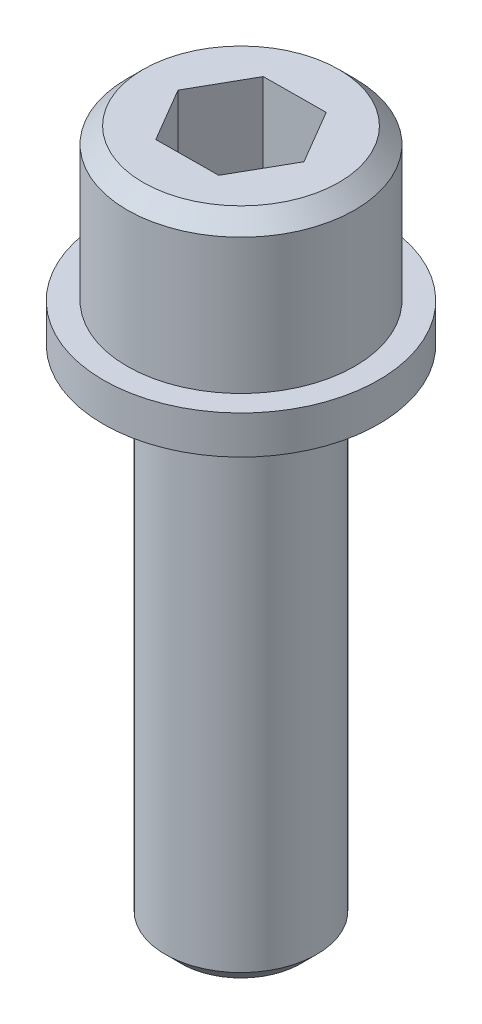
ISO-10303-21;
HEADER;
FILE_DESCRIPTION(('STEP AP214'),'2;1');
FILE_NAME('part.step','',(''),(''),'','','');
FILE_SCHEMA(('AUTOMOTIVE_DESIGN { 1 0 10303 214 1 1 1 1 }'));
ENDSEC;
DATA;
#1=APPLICATION_CONTEXT('core data for automotive mechanical design processes');
#2=APPLICATION_PROTOCOL_DEFINITION('international standard','automotive_design',2000,#1);
#3=PRODUCT_CONTEXT('',#1,'mechanical');
#4=PRODUCT('Part','Part','',(#3));
#5=PRODUCT_RELATED_PRODUCT_CATEGORY('part','',(#4));
#6=PRODUCT_DEFINITION_FORMATION('','',#4);
#7=PRODUCT_DEFINITION_CONTEXT('part definition',#1,'design');
#8=PRODUCT_DEFINITION('design','',#6,#7);
#9=PRODUCT_DEFINITION_SHAPE('','',#8);
#10=(LENGTH_UNIT() NAMED_UNIT(*) SI_UNIT(.MILLI.,.METRE.));
#11=(NAMED_UNIT(*) PLANE_ANGLE_UNIT() SI_UNIT($,.RADIAN.));
#12=(NAMED_UNIT(*) SI_UNIT($,.STERADIAN.) SOLID_ANGLE_UNIT());
#13=UNCERTAINTY_MEASURE_WITH_UNIT(LENGTH_MEASURE(1.E-05),#10,'distance_accuracy_value','');
#14=(GEOMETRIC_REPRESENTATION_CONTEXT(3) GLOBAL_UNCERTAINTY_ASSIGNED_CONTEXT((#13)) GLOBAL_UNIT_ASSIGNED_CONTEXT((#10,
#11,#12)) REPRESENTATION_CONTEXT('',''));
#15=CARTESIAN_POINT('',(0.,0.,0.));
#16=DIRECTION('',(0.,0.,1.));
#17=DIRECTION('',(1.,0.,0.));
#18=AXIS2_PLACEMENT_3D('',#15,#16,#17);
#19=CARTESIAN_POINT('',(0.,2.4,0.));
#20=DIRECTION('',(0.,-1.,0.));
#21=DIRECTION('',(0.,0.,-1.));
#22=AXIS2_PLACEMENT_3D('',#19,#20,#21);
#23=CYLINDRICAL_SURFACE('',#22,8.64999999999999);
#24=CARTESIAN_POINT('',(0.,2.4,0.));
#25=DIRECTION('',(0.,1.,0.));
#26=DIRECTION('',(0.,0.,1.));
#27=AXIS2_PLACEMENT_3D('',#24,#25,#26);
#28=CIRCLE('',#27,8.64999999999999);
#29=CARTESIAN_POINT('',(0.,2.4,8.64999999999999));
#30=VERTEX_POINT('',#29);
#31=EDGE_CURVE('E182',#30,#30,#28,.T.);
#32=ORIENTED_EDGE('',*,*,#31,.F.);
#33=EDGE_LOOP('',(#32));
#34=FACE_BOUND('',#33,.T.);
#35=CARTESIAN_POINT('',(0.,0.,0.));
#36=DIRECTION('',(0.,1.,0.));
#37=DIRECTION('',(0.,0.,1.));
#38=AXIS2_PLACEMENT_3D('',#35,#36,#37);
#39=CIRCLE('',#38,8.64999999999999);
#40=CARTESIAN_POINT('',(0.,0.,8.64999999999999));
#41=VERTEX_POINT('',#40);
#42=EDGE_CURVE('E167',#41,#41,#39,.T.);
#43=ORIENTED_EDGE('',*,*,#42,.T.);
#44=EDGE_LOOP('',(#43));
#45=FACE_BOUND('',#44,.T.);
#46=ADVANCED_FACE('F51',(#34,#45),#23,.T.);
#47=CARTESIAN_POINT('',(0.,2.4,0.));
#48=DIRECTION('',(0.,1.,0.));
#49=DIRECTION('',(0.,0.,1.));
#50=AXIS2_PLACEMENT_3D('',#47,#48,#49);
#51=PLANE('',#50);
#52=CARTESIAN_POINT('',(0.,2.4,0.));
#53=DIRECTION('',(0.,1.,0.));
#54=DIRECTION('',(0.,0.,1.));
#55=AXIS2_PLACEMENT_3D('',#52,#53,#54);
#56=CIRCLE('',#55,7.15);
#57=CARTESIAN_POINT('',(0.,2.4,7.15));
#58=VERTEX_POINT('',#57);
#59=EDGE_CURVE('E177',#58,#58,#56,.T.);
#60=ORIENTED_EDGE('',*,*,#59,.F.);
#61=EDGE_LOOP('',(#60));
#62=FACE_BOUND('',#61,.T.);
#63=ORIENTED_EDGE('',*,*,#31,.T.);
#64=EDGE_LOOP('',(#63));
#65=FACE_BOUND('',#64,.T.);
#66=ADVANCED_FACE('F231',(#62,#65),#51,.T.);
#67=CARTESIAN_POINT('',(0.,0.,0.));
#68=DIRECTION('',(0.,1.,0.));
#69=DIRECTION('',(0.,0.,1.));
#70=AXIS2_PLACEMENT_3D('',#67,#68,#69);
#71=PLANE('',#70);
#72=CARTESIAN_POINT('',(0.,0.,0.));
#73=DIRECTION('',(0.,-1.,0.));
#74=DIRECTION('',(0.,0.,-1.));
#75=AXIS2_PLACEMENT_3D('',#72,#73,#74);
#76=CIRCLE('',#75,4.75);
#77=CARTESIAN_POINT('',(0.,0.,-4.75));
#78=VERTEX_POINT('',#77);
#79=EDGE_CURVE('E195',#78,#78,#76,.T.);
#80=ORIENTED_EDGE('',*,*,#79,.F.);
#81=EDGE_LOOP('',(#80));
#82=FACE_BOUND('',#81,.T.);
#83=ORIENTED_EDGE('',*,*,#42,.F.);
#84=EDGE_LOOP('',(#83));
#85=FACE_BOUND('',#84,.T.);
#86=ADVANCED_FACE('F237',(#82,#85),#71,.F.);
#87=CARTESIAN_POINT('',(0.,11.9,0.));
#88=DIRECTION('',(0.,-1.,0.));
#89=DIRECTION('',(0.,0.,-1.));
#90=AXIS2_PLACEMENT_3D('',#87,#88,#89);
#91=CYLINDRICAL_SURFACE('',#90,7.15);
#92=CARTESIAN_POINT('',(0.,10.9,0.));
#93=DIRECTION('',(0.,1.,0.));
#94=DIRECTION('',(0.,0.,1.));
#95=AXIS2_PLACEMENT_3D('',#92,#93,#94);
#96=CIRCLE('',#95,7.15);
#97=CARTESIAN_POINT('',(0.,10.9,7.15));
#98=VERTEX_POINT('',#97);
#99=EDGE_CURVE('E192',#98,#98,#96,.F.);
#100=ORIENTED_EDGE('',*,*,#99,.T.);
#101=EDGE_LOOP('',(#100));
#102=FACE_BOUND('',#101,.T.);
#103=ORIENTED_EDGE('',*,*,#59,.T.);
#104=EDGE_LOOP('',(#103));
#105=FACE_BOUND('',#104,.T.);
#106=ADVANCED_FACE('F252',(#102,#105),#91,.T.);
#107=CARTESIAN_POINT('',(0.,11.9,0.));
#108=DIRECTION('',(0.,1.,0.));
#109=DIRECTION('',(0.,0.,1.));
#110=AXIS2_PLACEMENT_3D('',#107,#108,#109);
#111=PLANE('',#110);
#112=DIRECTION('',(-0.999973008537401,0.,0.00734725776461483));
#113=VECTOR('',#112,1.);
#114=CARTESIAN_POINT('',(1.93795725484917,11.9,-3.41433082927106));
#115=LINE('',#114,#113);
#116=CARTESIAN_POINT('',(1.93795725484917,11.9,-3.41433082927106));
#117=VERTEX_POINT('',#116);
#118=CARTESIAN_POINT('',(-1.98791860764855,11.9,-3.38548562878326));
#119=VERTEX_POINT('',#118);
#120=EDGE_CURVE('E68',#117,#119,#115,.T.);
#121=ORIENTED_EDGE('',*,*,#120,.F.);
#122=DIRECTION('',(-0.506349416141009,0.,-0.862328399609835));
#123=VECTOR('',#122,1.);
#124=CARTESIAN_POINT('',(3.92587586249771,11.9,-0.0288452004878007));
#125=LINE('',#124,#123);
#126=CARTESIAN_POINT('',(3.92587586249771,11.9,-0.0288452004878007));
#127=VERTEX_POINT('',#126);
#128=EDGE_CURVE('E161',#127,#117,#125,.T.);
#129=ORIENTED_EDGE('',*,*,#128,.F.);
#130=DIRECTION('',(0.493623592396392,0.,-0.86967565737445));
#131=VECTOR('',#130,1.);
#132=CARTESIAN_POINT('',(1.98791860764855,11.9,3.38548562878326));
#133=LINE('',#132,#131);
#134=CARTESIAN_POINT('',(1.98791860764855,11.9,3.38548562878326));
#135=VERTEX_POINT('',#134);
#136=EDGE_CURVE('E158',#135,#127,#133,.T.);
#137=ORIENTED_EDGE('',*,*,#136,.F.);
#138=DIRECTION('',(0.999973008537401,0.,-0.00734725776461495));
#139=VECTOR('',#138,1.);
#140=CARTESIAN_POINT('',(-1.93795725484917,11.9,3.41433082927106));
#141=LINE('',#140,#139);
#142=CARTESIAN_POINT('',(-1.93795725484917,11.9,3.41433082927106));
#143=VERTEX_POINT('',#142);
#144=EDGE_CURVE('E116',#143,#135,#141,.T.);
#145=ORIENTED_EDGE('',*,*,#144,.F.);
#146=DIRECTION('',(0.506349416141009,0.,0.862328399609835));
#147=VECTOR('',#146,1.);
#148=CARTESIAN_POINT('',(-3.92587586249771,11.9,0.0288452004878003));
#149=LINE('',#148,#147);
#150=CARTESIAN_POINT('',(-3.92587586249771,11.9,0.0288452004878003));
#151=VERTEX_POINT('',#150);
#152=EDGE_CURVE('E152',#151,#143,#149,.T.);
#153=ORIENTED_EDGE('',*,*,#152,.F.);
#154=DIRECTION('',(-0.493623592396391,0.,0.86967565737445));
#155=VECTOR('',#154,1.);
#156=CARTESIAN_POINT('',(-1.98791860764855,11.9,-3.38548562878326));
#157=LINE('',#156,#155);
#158=EDGE_CURVE('E148',#119,#151,#157,.T.);
#159=ORIENTED_EDGE('',*,*,#158,.F.);
#160=EDGE_LOOP('',(#121,#129,#137,#145,#153,#159));
#161=FACE_BOUND('',#160,.T.);
#162=CARTESIAN_POINT('',(0.,11.9,0.));
#163=DIRECTION('',(0.,1.,0.));
#164=DIRECTION('',(0.,0.,1.));
#165=AXIS2_PLACEMENT_3D('',#162,#163,#164);
#166=CIRCLE('',#165,6.15);
#167=CARTESIAN_POINT('',(0.,11.9,6.15));
#168=VERTEX_POINT('',#167);
#169=EDGE_CURVE('E181',#168,#168,#166,.T.);
#170=ORIENTED_EDGE('',*,*,#169,.T.);
#171=EDGE_LOOP('',(#170));
#172=FACE_BOUND('',#171,.T.);
#173=ADVANCED_FACE('F215',(#161,#172),#111,.T.);
#174=CARTESIAN_POINT('',(0.,11.9,0.));
#175=DIRECTION('',(0.,-1.,0.));
#176=DIRECTION('',(0.,0.,-1.));
#177=AXIS2_PLACEMENT_3D('',#174,#175,#176);
#178=CONICAL_SURFACE('',#177,6.15,0.785398163397449);
#179=ORIENTED_EDGE('',*,*,#99,.F.);
#180=EDGE_LOOP('',(#179));
#181=FACE_BOUND('',#180,.T.);
#182=ORIENTED_EDGE('',*,*,#169,.F.);
#183=EDGE_LOOP('',(#182));
#184=FACE_BOUND('',#183,.T.);
#185=ADVANCED_FACE('F227',(#181,#184),#178,.T.);
#186=CARTESIAN_POINT('',(1.93795725484917,5.5,-3.41433082927106));
#187=DIRECTION('',(-0.00734725776461483,0.,-0.999973008537401));
#188=DIRECTION('',(-0.999973008537401,0.,0.00734725776461483));
#189=AXIS2_PLACEMENT_3D('',#186,#187,#188);
#190=PLANE('',#189);
#191=ORIENTED_EDGE('',*,*,#120,.T.);
#192=DIRECTION('',(0.,1.,0.));
#193=VECTOR('',#192,1.);
#194=CARTESIAN_POINT('',(-1.98791860764855,5.5,-3.38548562878326));
#195=LINE('',#194,#193);
#196=CARTESIAN_POINT('',(-1.98791860764855,5.5,-3.38548562878326));
#197=VERTEX_POINT('',#196);
#198=EDGE_CURVE('E98',#197,#119,#195,.T.);
#199=ORIENTED_EDGE('',*,*,#198,.F.);
#200=DIRECTION('',(-0.999973008537401,0.,0.00734725776461483));
#201=VECTOR('',#200,1.);
#202=CARTESIAN_POINT('',(1.93795725484917,5.5,-3.41433082927106));
#203=LINE('',#202,#201);
#204=CARTESIAN_POINT('',(1.93795725484917,5.5,-3.41433082927106));
#205=VERTEX_POINT('',#204);
#206=EDGE_CURVE('E164',#205,#197,#203,.T.);
#207=ORIENTED_EDGE('',*,*,#206,.F.);
#208=DIRECTION('',(0.,1.,0.));
#209=VECTOR('',#208,1.);
#210=CARTESIAN_POINT('',(1.93795725484917,5.5,-3.41433082927106));
#211=LINE('',#210,#209);
#212=EDGE_CURVE('E76',#205,#117,#211,.T.);
#213=ORIENTED_EDGE('',*,*,#212,.T.);
#214=EDGE_LOOP('',(#191,#199,#207,#213));
#215=FACE_BOUND('',#214,.T.);
#216=ADVANCED_FACE('F220',(#215),#190,.F.);
#217=CARTESIAN_POINT('',(3.92587586249771,5.5,-0.0288452004878007));
#218=DIRECTION('',(0.862328399609835,0.,-0.506349416141009));
#219=DIRECTION('',(-0.506349416141009,0.,-0.862328399609835));
#220=AXIS2_PLACEMENT_3D('',#217,#218,#219);
#221=PLANE('',#220);
#222=ORIENTED_EDGE('',*,*,#128,.T.);
#223=ORIENTED_EDGE('',*,*,#212,.F.);
#224=DIRECTION('',(-0.506349416141009,0.,-0.862328399609835));
#225=VECTOR('',#224,1.);
#226=CARTESIAN_POINT('',(3.92587586249771,5.5,-0.0288452004878007));
#227=LINE('',#226,#225);
#228=CARTESIAN_POINT('',(3.92587586249771,5.5,-0.0288452004878007));
#229=VERTEX_POINT('',#228);
#230=EDGE_CURVE('E130',#229,#205,#227,.T.);
#231=ORIENTED_EDGE('',*,*,#230,.F.);
#232=DIRECTION('',(0.,1.,0.));
#233=VECTOR('',#232,1.);
#234=CARTESIAN_POINT('',(3.92587586249771,5.5,-0.0288452004878007));
#235=LINE('',#234,#233);
#236=EDGE_CURVE('E121',#229,#127,#235,.T.);
#237=ORIENTED_EDGE('',*,*,#236,.T.);
#238=EDGE_LOOP('',(#222,#223,#231,#237));
#239=FACE_BOUND('',#238,.T.);
#240=ADVANCED_FACE('F218',(#239),#221,.F.);
#241=CARTESIAN_POINT('',(1.98791860764855,5.5,3.38548562878326));
#242=DIRECTION('',(0.86967565737445,0.,0.493623592396392));
#243=DIRECTION('',(0.493623592396392,0.,-0.86967565737445));
#244=AXIS2_PLACEMENT_3D('',#241,#242,#243);
#245=PLANE('',#244);
#246=ORIENTED_EDGE('',*,*,#136,.T.);
#247=ORIENTED_EDGE('',*,*,#236,.F.);
#248=DIRECTION('',(0.493623592396392,0.,-0.86967565737445));
#249=VECTOR('',#248,1.);
#250=CARTESIAN_POINT('',(1.98791860764855,5.5,3.38548562878326));
#251=LINE('',#250,#249);
#252=CARTESIAN_POINT('',(1.98791860764855,5.5,3.38548562878326));
#253=VERTEX_POINT('',#252);
#254=EDGE_CURVE('E125',#253,#229,#251,.T.);
#255=ORIENTED_EDGE('',*,*,#254,.F.);
#256=DIRECTION('',(0.,1.,0.));
#257=VECTOR('',#256,1.);
#258=CARTESIAN_POINT('',(1.98791860764855,5.5,3.38548562878326));
#259=LINE('',#258,#257);
#260=EDGE_CURVE('E109',#253,#135,#259,.T.);
#261=ORIENTED_EDGE('',*,*,#260,.T.);
#262=EDGE_LOOP('',(#246,#247,#255,#261));
#263=FACE_BOUND('',#262,.T.);
#264=ADVANCED_FACE('F126',(#263),#245,.F.);
#265=CARTESIAN_POINT('',(-1.93795725484917,5.5,3.41433082927106));
#266=DIRECTION('',(0.00734725776461495,0.,0.999973008537401));
#267=DIRECTION('',(0.999973008537401,0.,-0.00734725776461495));
#268=AXIS2_PLACEMENT_3D('',#265,#266,#267);
#269=PLANE('',#268);
#270=ORIENTED_EDGE('',*,*,#144,.T.);
#271=ORIENTED_EDGE('',*,*,#260,.F.);
#272=DIRECTION('',(0.999973008537401,0.,-0.00734725776461495));
#273=VECTOR('',#272,1.);
#274=CARTESIAN_POINT('',(-1.93795725484917,5.5,3.41433082927106));
#275=LINE('',#274,#273);
#276=CARTESIAN_POINT('',(-1.93795725484917,5.5,3.41433082927106));
#277=VERTEX_POINT('',#276);
#278=EDGE_CURVE('E113',#277,#253,#275,.T.);
#279=ORIENTED_EDGE('',*,*,#278,.F.);
#280=DIRECTION('',(0.,1.,0.));
#281=VECTOR('',#280,1.);
#282=CARTESIAN_POINT('',(-1.93795725484917,5.5,3.41433082927106));
#283=LINE('',#282,#281);
#284=EDGE_CURVE('E122',#277,#143,#283,.T.);
#285=ORIENTED_EDGE('',*,*,#284,.T.);
#286=EDGE_LOOP('',(#270,#271,#279,#285));
#287=FACE_BOUND('',#286,.T.);
#288=ADVANCED_FACE('F111',(#287),#269,.F.);
#289=CARTESIAN_POINT('',(-3.92587586249771,5.5,0.0288452004878003));
#290=DIRECTION('',(-0.862328399609835,0.,0.506349416141009));
#291=DIRECTION('',(0.506349416141009,0.,0.862328399609835));
#292=AXIS2_PLACEMENT_3D('',#289,#290,#291);
#293=PLANE('',#292);
#294=ORIENTED_EDGE('',*,*,#152,.T.);
#295=ORIENTED_EDGE('',*,*,#284,.F.);
#296=DIRECTION('',(0.506349416141009,0.,0.862328399609835));
#297=VECTOR('',#296,1.);
#298=CARTESIAN_POINT('',(-3.92587586249771,5.5,0.0288452004878003));
#299=LINE('',#298,#297);
#300=CARTESIAN_POINT('',(-3.92587586249771,5.5,0.0288452004878003));
#301=VERTEX_POINT('',#300);
#302=EDGE_CURVE('E136',#301,#277,#299,.T.);
#303=ORIENTED_EDGE('',*,*,#302,.F.);
#304=DIRECTION('',(0.,1.,0.));
#305=VECTOR('',#304,1.);
#306=CARTESIAN_POINT('',(-3.92587586249771,5.5,0.0288452004878003));
#307=LINE('',#306,#305);
#308=EDGE_CURVE('E172',#301,#151,#307,.T.);
#309=ORIENTED_EDGE('',*,*,#308,.T.);
#310=EDGE_LOOP('',(#294,#295,#303,#309));
#311=FACE_BOUND('',#310,.T.);
#312=ADVANCED_FACE('F213',(#311),#293,.F.);
#313=CARTESIAN_POINT('',(-1.98791860764855,5.5,-3.38548562878326));
#314=DIRECTION('',(-0.86967565737445,0.,-0.493623592396391));
#315=DIRECTION('',(-0.493623592396391,0.,0.86967565737445));
#316=AXIS2_PLACEMENT_3D('',#313,#314,#315);
#317=PLANE('',#316);
#318=ORIENTED_EDGE('',*,*,#158,.T.);
#319=ORIENTED_EDGE('',*,*,#308,.F.);
#320=DIRECTION('',(-0.493623592396391,0.,0.86967565737445));
#321=VECTOR('',#320,1.);
#322=CARTESIAN_POINT('',(-1.98791860764855,5.5,-3.38548562878326));
#323=LINE('',#322,#321);
#324=EDGE_CURVE('E140',#197,#301,#323,.T.);
#325=ORIENTED_EDGE('',*,*,#324,.F.);
#326=ORIENTED_EDGE('',*,*,#198,.T.);
#327=EDGE_LOOP('',(#318,#319,#325,#326));
#328=FACE_BOUND('',#327,.T.);
#329=ADVANCED_FACE('F209',(#328),#317,.F.);
#330=CARTESIAN_POINT('',(0.,5.5,0.));
#331=DIRECTION('',(0.,1.,0.));
#332=DIRECTION('',(0.,0.,1.));
#333=AXIS2_PLACEMENT_3D('',#330,#331,#332);
#334=PLANE('',#333);
#335=ORIENTED_EDGE('',*,*,#206,.T.);
#336=ORIENTED_EDGE('',*,*,#324,.T.);
#337=ORIENTED_EDGE('',*,*,#302,.T.);
#338=ORIENTED_EDGE('',*,*,#278,.T.);
#339=ORIENTED_EDGE('',*,*,#254,.T.);
#340=ORIENTED_EDGE('',*,*,#230,.T.);
#341=EDGE_LOOP('',(#335,#336,#337,#338,#339,#340));
#342=FACE_BOUND('',#341,.T.);
#343=ADVANCED_FACE('F133',(#342),#334,.T.);
#344=CARTESIAN_POINT('',(0.,-31.8,0.));
#345=DIRECTION('',(0.,1.,0.));
#346=DIRECTION('',(0.,0.,1.));
#347=AXIS2_PLACEMENT_3D('',#344,#345,#346);
#348=CYLINDRICAL_SURFACE('',#347,4.75);
#349=CARTESIAN_POINT('',(0.,-30.8,0.));
#350=DIRECTION('',(0.,-1.,0.));
#351=DIRECTION('',(0.,0.,-1.));
#352=AXIS2_PLACEMENT_3D('',#349,#350,#351);
#353=CIRCLE('',#352,4.75);
#354=CARTESIAN_POINT('',(0.,-30.8,-4.75));
#355=VERTEX_POINT('',#354);
#356=EDGE_CURVE('E13',#355,#355,#353,.F.);
#357=ORIENTED_EDGE('',*,*,#356,.T.);
#358=EDGE_LOOP('',(#357));
#359=FACE_BOUND('',#358,.T.);
#360=ORIENTED_EDGE('',*,*,#79,.T.);
#361=EDGE_LOOP('',(#360));
#362=FACE_BOUND('',#361,.T.);
#363=ADVANCED_FACE('F292',(#359,#362),#348,.T.);
#364=CARTESIAN_POINT('',(0.,-31.8,0.));
#365=DIRECTION('',(0.,-1.,0.));
#366=DIRECTION('',(0.,0.,-1.));
#367=AXIS2_PLACEMENT_3D('',#364,#365,#366);
#368=PLANE('',#367);
#369=CARTESIAN_POINT('',(0.,-31.8,0.));
#370=DIRECTION('',(0.,-1.,0.));
#371=DIRECTION('',(0.,0.,-1.));
#372=AXIS2_PLACEMENT_3D('',#369,#370,#371);
#373=CIRCLE('',#372,3.75000000000001);
#374=CARTESIAN_POINT('',(0.,-31.8,-3.75000000000001));
#375=VERTEX_POINT('',#374);
#376=EDGE_CURVE('E61',#375,#375,#373,.T.);
#377=ORIENTED_EDGE('',*,*,#376,.T.);
#378=EDGE_LOOP('',(#377));
#379=FACE_BOUND('',#378,.T.);
#380=ADVANCED_FACE('F306',(#379),#368,.T.);
#381=CARTESIAN_POINT('',(0.,-31.8,0.));
#382=DIRECTION('',(0.,1.,0.));
#383=DIRECTION('',(0.,0.,1.));
#384=AXIS2_PLACEMENT_3D('',#381,#382,#383);
#385=CONICAL_SURFACE('',#384,3.75000000000001,0.785398163397446);
#386=ORIENTED_EDGE('',*,*,#356,.F.);
#387=EDGE_LOOP('',(#386));
#388=FACE_BOUND('',#387,.T.);
#389=ORIENTED_EDGE('',*,*,#376,.F.);
#390=EDGE_LOOP('',(#389));
#391=FACE_BOUND('',#390,.T.);
#392=ADVANCED_FACE('F54',(#388,#391),#385,.T.);
#393=CLOSED_SHELL('',(#46,#66,#86,#106,#173,#185,#216,#240,#264,#288,#312,#329,#343,#363,#380,#392));
#394=MANIFOLD_SOLID_BREP('B2',#393);
#395=ADVANCED_BREP_SHAPE_REPRESENTATION('',(#18,#394),#14);
#396=SHAPE_DEFINITION_REPRESENTATION(#9,#395);
ENDSEC;
END-ISO-10303-21;
